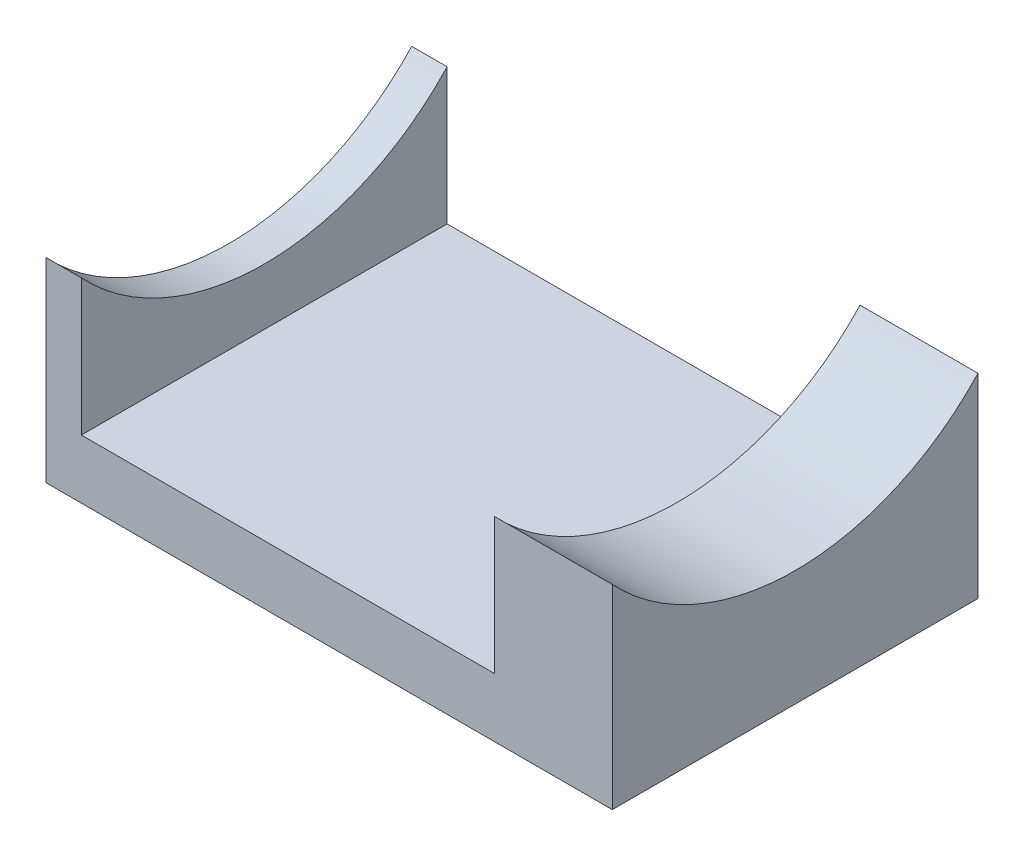
ISO-10303-21;
HEADER;
FILE_DESCRIPTION(('STEP AP214'),'2;1');
FILE_NAME('part.step','',(''),(''),'','','');
FILE_SCHEMA(('AUTOMOTIVE_DESIGN { 1 0 10303 214 1 1 1 1 }'));
ENDSEC;
DATA;
#1=APPLICATION_CONTEXT('core data for automotive mechanical design processes');
#2=APPLICATION_PROTOCOL_DEFINITION('international standard','automotive_design',2000,#1);
#3=PRODUCT_CONTEXT('',#1,'mechanical');
#4=PRODUCT('Part','Part','',(#3));
#5=PRODUCT_RELATED_PRODUCT_CATEGORY('part','',(#4));
#6=PRODUCT_DEFINITION_FORMATION('','',#4);
#7=PRODUCT_DEFINITION_CONTEXT('part definition',#1,'design');
#8=PRODUCT_DEFINITION('design','',#6,#7);
#9=PRODUCT_DEFINITION_SHAPE('','',#8);
#10=(LENGTH_UNIT() NAMED_UNIT(*) SI_UNIT(.MILLI.,.METRE.));
#11=(NAMED_UNIT(*) PLANE_ANGLE_UNIT() SI_UNIT($,.RADIAN.));
#12=(NAMED_UNIT(*) SI_UNIT($,.STERADIAN.) SOLID_ANGLE_UNIT());
#13=UNCERTAINTY_MEASURE_WITH_UNIT(LENGTH_MEASURE(1.E-05),#10,'distance_accuracy_value','');
#14=(GEOMETRIC_REPRESENTATION_CONTEXT(3) GLOBAL_UNCERTAINTY_ASSIGNED_CONTEXT((#13)) GLOBAL_UNIT_ASSIGNED_CONTEXT((#10,
#11,#12)) REPRESENTATION_CONTEXT('',''));
#15=CARTESIAN_POINT('',(0.,0.,0.));
#16=DIRECTION('',(0.,0.,1.));
#17=DIRECTION('',(1.,0.,0.));
#18=AXIS2_PLACEMENT_3D('',#15,#16,#17);
#19=CARTESIAN_POINT('',(24.,-15.5,15.5));
#20=DIRECTION('',(-1.,0.,0.));
#21=DIRECTION('',(0.,0.,1.));
#22=AXIS2_PLACEMENT_3D('',#19,#20,#21);
#23=PLANE('',#22);
#24=DIRECTION('',(0.,1.,0.));
#25=VECTOR('',#24,1.);
#26=CARTESIAN_POINT('',(24.,-15.5,-15.5));
#27=LINE('',#26,#25);
#28=CARTESIAN_POINT('',(24.,-15.5,-15.5));
#29=VERTEX_POINT('',#28);
#30=CARTESIAN_POINT('',(24.,1.03659791058826,-15.5));
#31=VERTEX_POINT('',#30);
#32=EDGE_CURVE('E145',#29,#31,#27,.T.);
#33=ORIENTED_EDGE('',*,*,#32,.T.);
#34=CARTESIAN_POINT('',(24.,15.5,0.));
#35=DIRECTION('',(1.,0.,0.));
#36=DIRECTION('',(0.,0.,-1.));
#37=AXIS2_PLACEMENT_3D('',#34,#35,#36);
#38=CIRCLE('',#37,21.2);
#39=CARTESIAN_POINT('',(24.,1.03659791058826,15.5));
#40=VERTEX_POINT('',#39);
#41=EDGE_CURVE('E115',#40,#31,#38,.T.);
#42=ORIENTED_EDGE('',*,*,#41,.F.);
#43=DIRECTION('',(0.,1.,0.));
#44=VECTOR('',#43,1.);
#45=CARTESIAN_POINT('',(24.,-15.5,15.5));
#46=LINE('',#45,#44);
#47=CARTESIAN_POINT('',(24.,-15.5,15.5));
#48=VERTEX_POINT('',#47);
#49=EDGE_CURVE('E135',#48,#40,#46,.T.);
#50=ORIENTED_EDGE('',*,*,#49,.F.);
#51=DIRECTION('',(0.,0.,-1.));
#52=VECTOR('',#51,1.);
#53=CARTESIAN_POINT('',(24.,-15.5,15.5));
#54=LINE('',#53,#52);
#55=EDGE_CURVE('E139',#48,#29,#54,.T.);
#56=ORIENTED_EDGE('',*,*,#55,.T.);
#57=EDGE_LOOP('',(#33,#42,#50,#56));
#58=FACE_BOUND('',#57,.T.);
#59=ADVANCED_FACE('F43',(#58),#23,.F.);
#60=CARTESIAN_POINT('',(-24.,-15.5,15.5));
#61=DIRECTION('',(1.,0.,0.));
#62=DIRECTION('',(0.,0.,-1.));
#63=AXIS2_PLACEMENT_3D('',#60,#61,#62);
#64=PLANE('',#63);
#65=DIRECTION('',(0.,-1.,0.));
#66=VECTOR('',#65,1.);
#67=CARTESIAN_POINT('',(-24.,-15.5,15.5));
#68=LINE('',#67,#66);
#69=CARTESIAN_POINT('',(-24.,1.03659791058826,15.5));
#70=VERTEX_POINT('',#69);
#71=CARTESIAN_POINT('',(-24.,-15.5,15.5));
#72=VERTEX_POINT('',#71);
#73=EDGE_CURVE('E121',#70,#72,#68,.T.);
#74=ORIENTED_EDGE('',*,*,#73,.F.);
#75=CARTESIAN_POINT('',(-24.,15.5,0.));
#76=DIRECTION('',(1.,0.,0.));
#77=DIRECTION('',(0.,0.,-1.));
#78=AXIS2_PLACEMENT_3D('',#75,#76,#77);
#79=CIRCLE('',#78,21.2);
#80=CARTESIAN_POINT('',(-24.,1.03659791058826,-15.5));
#81=VERTEX_POINT('',#80);
#82=EDGE_CURVE('E107',#70,#81,#79,.T.);
#83=ORIENTED_EDGE('',*,*,#82,.T.);
#84=DIRECTION('',(0.,-1.,0.));
#85=VECTOR('',#84,1.);
#86=CARTESIAN_POINT('',(-24.,-15.5,-15.5));
#87=LINE('',#86,#85);
#88=CARTESIAN_POINT('',(-24.,-15.5,-15.5));
#89=VERTEX_POINT('',#88);
#90=EDGE_CURVE('E149',#81,#89,#87,.T.);
#91=ORIENTED_EDGE('',*,*,#90,.T.);
#92=DIRECTION('',(0.,0.,-1.));
#93=VECTOR('',#92,1.);
#94=CARTESIAN_POINT('',(-24.,-15.5,15.5));
#95=LINE('',#94,#93);
#96=EDGE_CURVE('E131',#72,#89,#95,.T.);
#97=ORIENTED_EDGE('',*,*,#96,.F.);
#98=EDGE_LOOP('',(#74,#83,#91,#97));
#99=FACE_BOUND('',#98,.T.);
#100=ADVANCED_FACE('F129',(#99),#64,.F.);
#101=CARTESIAN_POINT('',(-24.,-15.5,15.5));
#102=DIRECTION('',(0.,1.,0.));
#103=DIRECTION('',(0.,0.,1.));
#104=AXIS2_PLACEMENT_3D('',#101,#102,#103);
#105=PLANE('',#104);
#106=CARTESIAN_POINT('',(-11.,-15.5,0.));
#107=DIRECTION('',(0.,1.,0.));
#108=DIRECTION('',(0.,0.,1.));
#109=AXIS2_PLACEMENT_3D('',#106,#107,#108);
#110=CIRCLE('',#109,2.5);
#111=CARTESIAN_POINT('',(-11.,-15.5,2.5));
#112=VERTEX_POINT('',#111);
#113=EDGE_CURVE('E11',#112,#112,#110,.F.);
#114=ORIENTED_EDGE('',*,*,#113,.F.);
#115=EDGE_LOOP('',(#114));
#116=FACE_BOUND('',#115,.T.);
#117=CARTESIAN_POINT('',(9.,-15.5,0.));
#118=DIRECTION('',(0.,1.,0.));
#119=DIRECTION('',(0.,0.,1.));
#120=AXIS2_PLACEMENT_3D('',#117,#118,#119);
#121=CIRCLE('',#120,2.5);
#122=CARTESIAN_POINT('',(9.,-15.5,2.5));
#123=VERTEX_POINT('',#122);
#124=EDGE_CURVE('E52',#123,#123,#121,.F.);
#125=ORIENTED_EDGE('',*,*,#124,.F.);
#126=EDGE_LOOP('',(#125));
#127=FACE_BOUND('',#126,.T.);
#128=DIRECTION('',(1.,0.,0.));
#129=VECTOR('',#128,1.);
#130=CARTESIAN_POINT('',(-24.,-15.5,-15.5));
#131=LINE('',#130,#129);
#132=EDGE_CURVE('E141',#89,#29,#131,.T.);
#133=ORIENTED_EDGE('',*,*,#132,.T.);
#134=ORIENTED_EDGE('',*,*,#55,.F.);
#135=DIRECTION('',(1.,0.,0.));
#136=VECTOR('',#135,1.);
#137=CARTESIAN_POINT('',(-24.,-15.5,15.5));
#138=LINE('',#137,#136);
#139=EDGE_CURVE('E134',#72,#48,#138,.T.);
#140=ORIENTED_EDGE('',*,*,#139,.F.);
#141=ORIENTED_EDGE('',*,*,#96,.T.);
#142=EDGE_LOOP('',(#133,#134,#140,#141));
#143=FACE_BOUND('',#142,.T.);
#144=ADVANCED_FACE('F169',(#116,#127,#143),#105,.F.);
#145=CARTESIAN_POINT('',(0.,0.,15.5));
#146=DIRECTION('',(0.,0.,-1.));
#147=DIRECTION('',(-1.,0.,0.));
#148=AXIS2_PLACEMENT_3D('',#145,#146,#147);
#149=PLANE('',#148);
#150=ORIENTED_EDGE('',*,*,#49,.T.);
#151=DIRECTION('',(1.,0.,0.));
#152=VECTOR('',#151,1.);
#153=CARTESIAN_POINT('',(-24.,1.03659791058826,15.5));
#154=LINE('',#153,#152);
#155=CARTESIAN_POINT('',(14.,1.03659791058826,15.5));
#156=VERTEX_POINT('',#155);
#157=EDGE_CURVE('E128',#40,#156,#154,.F.);
#158=ORIENTED_EDGE('',*,*,#157,.T.);
#159=DIRECTION('',(0.,1.,0.));
#160=VECTOR('',#159,1.);
#161=CARTESIAN_POINT('',(14.,15.5,15.5));
#162=LINE('',#161,#160);
#163=CARTESIAN_POINT('',(14.,-10.5,15.5));
#164=VERTEX_POINT('',#163);
#165=EDGE_CURVE('E208',#164,#156,#162,.T.);
#166=ORIENTED_EDGE('',*,*,#165,.F.);
#167=DIRECTION('',(1.,0.,0.));
#168=VECTOR('',#167,1.);
#169=CARTESIAN_POINT('',(-21.,-10.5,15.5));
#170=LINE('',#169,#168);
#171=CARTESIAN_POINT('',(-21.,-10.5,15.5));
#172=VERTEX_POINT('',#171);
#173=EDGE_CURVE('E204',#172,#164,#170,.T.);
#174=ORIENTED_EDGE('',*,*,#173,.F.);
#175=DIRECTION('',(0.,-1.,0.));
#176=VECTOR('',#175,1.);
#177=CARTESIAN_POINT('',(-21.,15.5,15.5));
#178=LINE('',#177,#176);
#179=CARTESIAN_POINT('',(-21.,1.03659791058826,15.5));
#180=VERTEX_POINT('',#179);
#181=EDGE_CURVE('E124',#180,#172,#178,.T.);
#182=ORIENTED_EDGE('',*,*,#181,.F.);
#183=EDGE_CURVE('E59',#180,#70,#154,.F.);
#184=ORIENTED_EDGE('',*,*,#183,.T.);
#185=ORIENTED_EDGE('',*,*,#73,.T.);
#186=ORIENTED_EDGE('',*,*,#139,.T.);
#187=EDGE_LOOP('',(#150,#158,#166,#174,#182,#184,#185,#186));
#188=FACE_BOUND('',#187,.T.);
#189=ADVANCED_FACE('F120',(#188),#149,.F.);
#190=CARTESIAN_POINT('',(0.,0.,-15.5));
#191=DIRECTION('',(0.,0.,-1.));
#192=DIRECTION('',(-1.,0.,0.));
#193=AXIS2_PLACEMENT_3D('',#190,#191,#192);
#194=PLANE('',#193);
#195=DIRECTION('',(1.,0.,0.));
#196=VECTOR('',#195,1.);
#197=CARTESIAN_POINT('',(-24.,1.03659791058826,-15.5));
#198=LINE('',#197,#196);
#199=CARTESIAN_POINT('',(14.,1.03659791058826,-15.5));
#200=VERTEX_POINT('',#199);
#201=EDGE_CURVE('E67',#31,#200,#198,.F.);
#202=ORIENTED_EDGE('',*,*,#201,.F.);
#203=ORIENTED_EDGE('',*,*,#32,.F.);
#204=ORIENTED_EDGE('',*,*,#132,.F.);
#205=ORIENTED_EDGE('',*,*,#90,.F.);
#206=CARTESIAN_POINT('',(-21.,1.03659791058826,-15.5));
#207=VERTEX_POINT('',#206);
#208=EDGE_CURVE('E110',#207,#81,#198,.F.);
#209=ORIENTED_EDGE('',*,*,#208,.F.);
#210=DIRECTION('',(0.,-1.,0.));
#211=VECTOR('',#210,1.);
#212=CARTESIAN_POINT('',(-21.,15.5,-15.5));
#213=LINE('',#212,#211);
#214=CARTESIAN_POINT('',(-21.,-10.5,-15.5));
#215=VERTEX_POINT('',#214);
#216=EDGE_CURVE('E199',#207,#215,#213,.T.);
#217=ORIENTED_EDGE('',*,*,#216,.T.);
#218=DIRECTION('',(1.,0.,0.));
#219=VECTOR('',#218,1.);
#220=CARTESIAN_POINT('',(-21.,-10.5,-15.5));
#221=LINE('',#220,#219);
#222=CARTESIAN_POINT('',(14.,-10.5,-15.5));
#223=VERTEX_POINT('',#222);
#224=EDGE_CURVE('E150',#215,#223,#221,.T.);
#225=ORIENTED_EDGE('',*,*,#224,.T.);
#226=DIRECTION('',(0.,1.,0.));
#227=VECTOR('',#226,1.);
#228=CARTESIAN_POINT('',(14.,15.5,-15.5));
#229=LINE('',#228,#227);
#230=EDGE_CURVE('E126',#223,#200,#229,.T.);
#231=ORIENTED_EDGE('',*,*,#230,.T.);
#232=EDGE_LOOP('',(#202,#203,#204,#205,#209,#217,#225,#231));
#233=FACE_BOUND('',#232,.T.);
#234=ADVANCED_FACE('F181',(#233),#194,.T.);
#235=CARTESIAN_POINT('',(-21.,15.5,-15.501));
#236=DIRECTION('',(-1.,0.,0.));
#237=DIRECTION('',(0.,0.,1.));
#238=AXIS2_PLACEMENT_3D('',#235,#236,#237);
#239=PLANE('',#238);
#240=ORIENTED_EDGE('',*,*,#216,.F.);
#241=CARTESIAN_POINT('',(-21.,15.5,0.));
#242=DIRECTION('',(-1.,0.,0.));
#243=DIRECTION('',(0.,0.,1.));
#244=AXIS2_PLACEMENT_3D('',#241,#242,#243);
#245=CIRCLE('',#244,21.2);
#246=EDGE_CURVE('E189',#207,#180,#245,.T.);
#247=ORIENTED_EDGE('',*,*,#246,.T.);
#248=ORIENTED_EDGE('',*,*,#181,.T.);
#249=DIRECTION('',(0.,0.,1.));
#250=VECTOR('',#249,1.);
#251=CARTESIAN_POINT('',(-21.,-10.5,-15.501));
#252=LINE('',#251,#250);
#253=EDGE_CURVE('E212',#215,#172,#252,.T.);
#254=ORIENTED_EDGE('',*,*,#253,.F.);
#255=EDGE_LOOP('',(#240,#247,#248,#254));
#256=FACE_BOUND('',#255,.T.);
#257=ADVANCED_FACE('F223',(#256),#239,.F.);
#258=CARTESIAN_POINT('',(14.,15.5,-15.501));
#259=DIRECTION('',(1.,0.,0.));
#260=DIRECTION('',(0.,0.,-1.));
#261=AXIS2_PLACEMENT_3D('',#258,#259,#260);
#262=PLANE('',#261);
#263=ORIENTED_EDGE('',*,*,#165,.T.);
#264=CARTESIAN_POINT('',(14.,15.5,0.));
#265=DIRECTION('',(1.,0.,0.));
#266=DIRECTION('',(0.,0.,-1.));
#267=AXIS2_PLACEMENT_3D('',#264,#265,#266);
#268=CIRCLE('',#267,21.2);
#269=EDGE_CURVE('E160',#156,#200,#268,.T.);
#270=ORIENTED_EDGE('',*,*,#269,.T.);
#271=ORIENTED_EDGE('',*,*,#230,.F.);
#272=DIRECTION('',(0.,0.,1.));
#273=VECTOR('',#272,1.);
#274=CARTESIAN_POINT('',(14.,-10.5,-15.501));
#275=LINE('',#274,#273);
#276=EDGE_CURVE('E213',#223,#164,#275,.T.);
#277=ORIENTED_EDGE('',*,*,#276,.T.);
#278=EDGE_LOOP('',(#263,#270,#271,#277));
#279=FACE_BOUND('',#278,.T.);
#280=ADVANCED_FACE('F225',(#279),#262,.F.);
#281=CARTESIAN_POINT('',(-21.,-10.5,-15.501));
#282=DIRECTION('',(0.,-1.,0.));
#283=DIRECTION('',(0.,0.,-1.));
#284=AXIS2_PLACEMENT_3D('',#281,#282,#283);
#285=PLANE('',#284);
#286=ORIENTED_EDGE('',*,*,#253,.T.);
#287=ORIENTED_EDGE('',*,*,#173,.T.);
#288=ORIENTED_EDGE('',*,*,#276,.F.);
#289=ORIENTED_EDGE('',*,*,#224,.F.);
#290=EDGE_LOOP('',(#286,#287,#288,#289));
#291=FACE_BOUND('',#290,.T.);
#292=ADVANCED_FACE('F222',(#291),#285,.F.);
#293=CARTESIAN_POINT('',(-24.,15.5,0.));
#294=DIRECTION('',(1.,0.,0.));
#295=DIRECTION('',(0.,0.,-1.));
#296=AXIS2_PLACEMENT_3D('',#293,#294,#295);
#297=CYLINDRICAL_SURFACE('',#296,21.2);
#298=ORIENTED_EDGE('',*,*,#41,.T.);
#299=ORIENTED_EDGE('',*,*,#201,.T.);
#300=ORIENTED_EDGE('',*,*,#269,.F.);
#301=ORIENTED_EDGE('',*,*,#157,.F.);
#302=EDGE_LOOP('',(#298,#299,#300,#301));
#303=FACE_BOUND('',#302,.T.);
#304=ADVANCED_FACE('F271',(#303),#297,.F.);
#305=ORIENTED_EDGE('',*,*,#246,.F.);
#306=ORIENTED_EDGE('',*,*,#208,.T.);
#307=ORIENTED_EDGE('',*,*,#82,.F.);
#308=ORIENTED_EDGE('',*,*,#183,.F.);
#309=EDGE_LOOP('',(#305,#306,#307,#308));
#310=FACE_BOUND('',#309,.T.);
#311=ADVANCED_FACE('F108',(#310),#297,.F.);
#312=CARTESIAN_POINT('',(9.,-20.5,0.));
#313=DIRECTION('',(0.,1.,0.));
#314=DIRECTION('',(0.,0.,1.));
#315=AXIS2_PLACEMENT_3D('',#312,#313,#314);
#316=PLANE('',#315);
#317=CARTESIAN_POINT('',(9.,-20.5,0.));
#318=DIRECTION('',(0.,1.,0.));
#319=DIRECTION('',(0.,0.,1.));
#320=AXIS2_PLACEMENT_3D('',#317,#318,#319);
#321=CIRCLE('',#320,2.5);
#322=CARTESIAN_POINT('',(9.,-20.5,2.5));
#323=VERTEX_POINT('',#322);
#324=EDGE_CURVE('E372',#323,#323,#321,.T.);
#325=ORIENTED_EDGE('',*,*,#324,.F.);
#326=EDGE_LOOP('',(#325));
#327=FACE_BOUND('',#326,.T.);
#328=ADVANCED_FACE('F285',(#327),#316,.F.);
#329=CARTESIAN_POINT('',(9.,-15.5,0.));
#330=DIRECTION('',(0.,1.,0.));
#331=DIRECTION('',(0.,0.,1.));
#332=AXIS2_PLACEMENT_3D('',#329,#330,#331);
#333=CYLINDRICAL_SURFACE('',#332,2.5);
#334=ORIENTED_EDGE('',*,*,#124,.T.);
#335=EDGE_LOOP('',(#334));
#336=FACE_BOUND('',#335,.T.);
#337=ORIENTED_EDGE('',*,*,#324,.T.);
#338=EDGE_LOOP('',(#337));
#339=FACE_BOUND('',#338,.T.);
#340=ADVANCED_FACE('F166',(#336,#339),#333,.T.);
#341=CARTESIAN_POINT('',(-11.,-20.5,0.));
#342=DIRECTION('',(0.,1.,0.));
#343=DIRECTION('',(0.,0.,1.));
#344=AXIS2_PLACEMENT_3D('',#341,#342,#343);
#345=PLANE('',#344);
#346=CARTESIAN_POINT('',(-11.,-20.5,0.));
#347=DIRECTION('',(0.,1.,0.));
#348=DIRECTION('',(0.,0.,1.));
#349=AXIS2_PLACEMENT_3D('',#346,#347,#348);
#350=CIRCLE('',#349,2.5);
#351=CARTESIAN_POINT('',(-11.,-20.5,2.5));
#352=VERTEX_POINT('',#351);
#353=EDGE_CURVE('E370',#352,#352,#350,.T.);
#354=ORIENTED_EDGE('',*,*,#353,.F.);
#355=EDGE_LOOP('',(#354));
#356=FACE_BOUND('',#355,.T.);
#357=ADVANCED_FACE('F300',(#356),#345,.F.);
#358=CARTESIAN_POINT('',(-11.,-15.5,0.));
#359=DIRECTION('',(0.,1.,0.));
#360=DIRECTION('',(0.,0.,1.));
#361=AXIS2_PLACEMENT_3D('',#358,#359,#360);
#362=CYLINDRICAL_SURFACE('',#361,2.5);
#363=ORIENTED_EDGE('',*,*,#113,.T.);
#364=EDGE_LOOP('',(#363));
#365=FACE_BOUND('',#364,.T.);
#366=ORIENTED_EDGE('',*,*,#353,.T.);
#367=EDGE_LOOP('',(#366));
#368=FACE_BOUND('',#367,.T.);
#369=ADVANCED_FACE('F309',(#365,#368),#362,.T.);
#370=CLOSED_SHELL('',(#59,#100,#144,#189,#234,#257,#280,#292,#304,#311,#328,#340,#357,#369));
#371=MANIFOLD_SOLID_BREP('B2',#370);
#372=ADVANCED_BREP_SHAPE_REPRESENTATION('',(#18,#371),#14);
#373=SHAPE_DEFINITION_REPRESENTATION(#9,#372);
ENDSEC;
END-ISO-10303-21;
